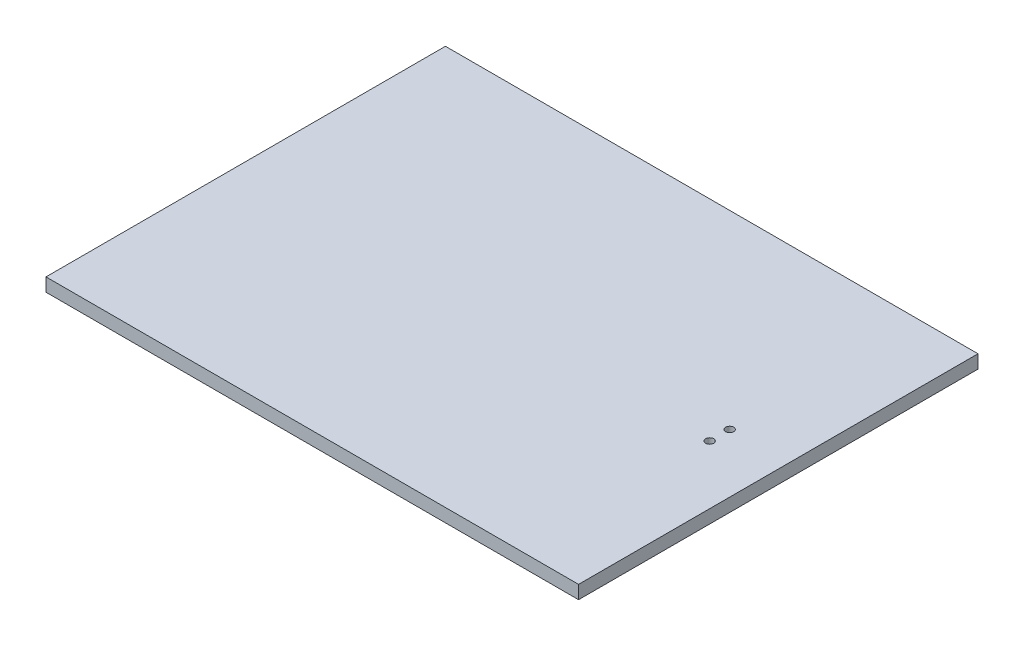
ISO-10303-21;
HEADER;
FILE_DESCRIPTION(('STEP AP214'),'2;1');
FILE_NAME('part.step','',(''),(''),'','','');
FILE_SCHEMA(('AUTOMOTIVE_DESIGN { 1 0 10303 214 1 1 1 1 }'));
ENDSEC;
DATA;
#1=APPLICATION_CONTEXT('core data for automotive mechanical design processes');
#2=APPLICATION_PROTOCOL_DEFINITION('international standard','automotive_design',2000,#1);
#3=PRODUCT_CONTEXT('',#1,'mechanical');
#4=PRODUCT('Part','Part','',(#3));
#5=PRODUCT_RELATED_PRODUCT_CATEGORY('part','',(#4));
#6=PRODUCT_DEFINITION_FORMATION('','',#4);
#7=PRODUCT_DEFINITION_CONTEXT('part definition',#1,'design');
#8=PRODUCT_DEFINITION('design','',#6,#7);
#9=PRODUCT_DEFINITION_SHAPE('','',#8);
#10=(LENGTH_UNIT() NAMED_UNIT(*) SI_UNIT(.MILLI.,.METRE.));
#11=(NAMED_UNIT(*) PLANE_ANGLE_UNIT() SI_UNIT($,.RADIAN.));
#12=(NAMED_UNIT(*) SI_UNIT($,.STERADIAN.) SOLID_ANGLE_UNIT());
#13=UNCERTAINTY_MEASURE_WITH_UNIT(LENGTH_MEASURE(1.E-05),#10,'distance_accuracy_value','');
#14=(GEOMETRIC_REPRESENTATION_CONTEXT(3) GLOBAL_UNCERTAINTY_ASSIGNED_CONTEXT((#13)) GLOBAL_UNIT_ASSIGNED_CONTEXT((#10,
#11,#12)) REPRESENTATION_CONTEXT('',''));
#15=CARTESIAN_POINT('',(0.,0.,0.));
#16=DIRECTION('',(0.,0.,1.));
#17=DIRECTION('',(1.,0.,0.));
#18=AXIS2_PLACEMENT_3D('',#15,#16,#17);
#19=CARTESIAN_POINT('',(0.,10.,0.));
#20=DIRECTION('',(0.,1.,0.));
#21=DIRECTION('',(0.,0.,1.));
#22=AXIS2_PLACEMENT_3D('',#19,#20,#21);
#23=PLANE('',#22);
#24=CARTESIAN_POINT('',(156.,10.,-7.5));
#25=DIRECTION('',(0.,1.,0.));
#26=DIRECTION('',(0.,0.,1.));
#27=AXIS2_PLACEMENT_3D('',#24,#25,#26);
#28=CIRCLE('',#27,2.99999999999999);
#29=CARTESIAN_POINT('',(156.,10.,-4.50000000000001));
#30=VERTEX_POINT('',#29);
#31=EDGE_CURVE('E99',#30,#30,#28,.T.);
#32=ORIENTED_EDGE('',*,*,#31,.F.);
#33=EDGE_LOOP('',(#32));
#34=FACE_BOUND('',#33,.T.);
#35=DIRECTION('',(0.,0.,1.));
#36=VECTOR('',#35,1.);
#37=CARTESIAN_POINT('',(-200.,10.,-150.));
#38=LINE('',#37,#36);
#39=CARTESIAN_POINT('',(-200.,10.,-150.));
#40=VERTEX_POINT('',#39);
#41=CARTESIAN_POINT('',(-200.,10.,150.));
#42=VERTEX_POINT('',#41);
#43=EDGE_CURVE('E84',#40,#42,#38,.T.);
#44=ORIENTED_EDGE('',*,*,#43,.T.);
#45=DIRECTION('',(1.,0.,0.));
#46=VECTOR('',#45,1.);
#47=CARTESIAN_POINT('',(-200.,10.,150.));
#48=LINE('',#47,#46);
#49=CARTESIAN_POINT('',(200.,10.,150.));
#50=VERTEX_POINT('',#49);
#51=EDGE_CURVE('E79',#42,#50,#48,.T.);
#52=ORIENTED_EDGE('',*,*,#51,.T.);
#53=DIRECTION('',(0.,0.,-1.));
#54=VECTOR('',#53,1.);
#55=CARTESIAN_POINT('',(200.,10.,-150.));
#56=LINE('',#55,#54);
#57=CARTESIAN_POINT('',(200.,10.,-150.));
#58=VERTEX_POINT('',#57);
#59=EDGE_CURVE('E82',#50,#58,#56,.T.);
#60=ORIENTED_EDGE('',*,*,#59,.T.);
#61=DIRECTION('',(-1.,0.,0.));
#62=VECTOR('',#61,1.);
#63=CARTESIAN_POINT('',(-200.,10.,-150.));
#64=LINE('',#63,#62);
#65=EDGE_CURVE('E49',#58,#40,#64,.T.);
#66=ORIENTED_EDGE('',*,*,#65,.T.);
#67=EDGE_LOOP('',(#44,#52,#60,#66));
#68=FACE_BOUND('',#67,.T.);
#69=CARTESIAN_POINT('',(156.,10.,7.5));
#70=DIRECTION('',(0.,1.,0.));
#71=DIRECTION('',(0.,0.,1.));
#72=AXIS2_PLACEMENT_3D('',#69,#70,#71);
#73=CIRCLE('',#72,2.99999999999999);
#74=CARTESIAN_POINT('',(156.,10.,10.5));
#75=VERTEX_POINT('',#74);
#76=EDGE_CURVE('E114',#75,#75,#73,.T.);
#77=ORIENTED_EDGE('',*,*,#76,.F.);
#78=EDGE_LOOP('',(#77));
#79=FACE_BOUND('',#78,.T.);
#80=ADVANCED_FACE('F32',(#34,#68,#79),#23,.T.);
#81=CARTESIAN_POINT('',(0.,0.,0.));
#82=DIRECTION('',(0.,1.,0.));
#83=DIRECTION('',(0.,0.,1.));
#84=AXIS2_PLACEMENT_3D('',#81,#82,#83);
#85=PLANE('',#84);
#86=DIRECTION('',(0.,0.,1.));
#87=VECTOR('',#86,1.);
#88=CARTESIAN_POINT('',(-200.,0.,-150.));
#89=LINE('',#88,#87);
#90=CARTESIAN_POINT('',(-200.,0.,-150.));
#91=VERTEX_POINT('',#90);
#92=CARTESIAN_POINT('',(-200.,0.,150.));
#93=VERTEX_POINT('',#92);
#94=EDGE_CURVE('E96',#91,#93,#89,.T.);
#95=ORIENTED_EDGE('',*,*,#94,.F.);
#96=DIRECTION('',(-1.,0.,0.));
#97=VECTOR('',#96,1.);
#98=CARTESIAN_POINT('',(-200.,0.,-150.));
#99=LINE('',#98,#97);
#100=CARTESIAN_POINT('',(200.,0.,-150.));
#101=VERTEX_POINT('',#100);
#102=EDGE_CURVE('E72',#101,#91,#99,.T.);
#103=ORIENTED_EDGE('',*,*,#102,.F.);
#104=DIRECTION('',(0.,0.,-1.));
#105=VECTOR('',#104,1.);
#106=CARTESIAN_POINT('',(200.,0.,-150.));
#107=LINE('',#106,#105);
#108=CARTESIAN_POINT('',(200.,0.,150.));
#109=VERTEX_POINT('',#108);
#110=EDGE_CURVE('E66',#109,#101,#107,.T.);
#111=ORIENTED_EDGE('',*,*,#110,.F.);
#112=DIRECTION('',(1.,0.,0.));
#113=VECTOR('',#112,1.);
#114=CARTESIAN_POINT('',(-200.,0.,150.));
#115=LINE('',#114,#113);
#116=EDGE_CURVE('E88',#93,#109,#115,.T.);
#117=ORIENTED_EDGE('',*,*,#116,.F.);
#118=EDGE_LOOP('',(#95,#103,#111,#117));
#119=FACE_BOUND('',#118,.T.);
#120=CARTESIAN_POINT('',(156.,0.,-7.5));
#121=DIRECTION('',(0.,1.,0.));
#122=DIRECTION('',(0.,0.,1.));
#123=AXIS2_PLACEMENT_3D('',#120,#121,#122);
#124=CIRCLE('',#123,2.99999999999999);
#125=CARTESIAN_POINT('',(156.,0.,-4.50000000000001));
#126=VERTEX_POINT('',#125);
#127=EDGE_CURVE('E111',#126,#126,#124,.T.);
#128=ORIENTED_EDGE('',*,*,#127,.T.);
#129=EDGE_LOOP('',(#128));
#130=FACE_BOUND('',#129,.T.);
#131=CARTESIAN_POINT('',(156.,0.,7.5));
#132=DIRECTION('',(0.,1.,0.));
#133=DIRECTION('',(0.,0.,1.));
#134=AXIS2_PLACEMENT_3D('',#131,#132,#133);
#135=CIRCLE('',#134,2.99999999999999);
#136=CARTESIAN_POINT('',(156.,0.,10.5));
#137=VERTEX_POINT('',#136);
#138=EDGE_CURVE('E117',#137,#137,#135,.T.);
#139=ORIENTED_EDGE('',*,*,#138,.T.);
#140=EDGE_LOOP('',(#139));
#141=FACE_BOUND('',#140,.T.);
#142=ADVANCED_FACE('F107',(#119,#130,#141),#85,.F.);
#143=CARTESIAN_POINT('',(-200.,10.,-150.));
#144=DIRECTION('',(1.,0.,0.));
#145=DIRECTION('',(0.,0.,-1.));
#146=AXIS2_PLACEMENT_3D('',#143,#144,#145);
#147=PLANE('',#146);
#148=ORIENTED_EDGE('',*,*,#94,.T.);
#149=DIRECTION('',(0.,-1.,0.));
#150=VECTOR('',#149,1.);
#151=CARTESIAN_POINT('',(-200.,10.,150.));
#152=LINE('',#151,#150);
#153=EDGE_CURVE('E11',#42,#93,#152,.T.);
#154=ORIENTED_EDGE('',*,*,#153,.F.);
#155=ORIENTED_EDGE('',*,*,#43,.F.);
#156=DIRECTION('',(0.,-1.,0.));
#157=VECTOR('',#156,1.);
#158=CARTESIAN_POINT('',(-200.,10.,-150.));
#159=LINE('',#158,#157);
#160=EDGE_CURVE('E92',#40,#91,#159,.T.);
#161=ORIENTED_EDGE('',*,*,#160,.T.);
#162=EDGE_LOOP('',(#148,#154,#155,#161));
#163=FACE_BOUND('',#162,.T.);
#164=ADVANCED_FACE('F34',(#163),#147,.F.);
#165=CARTESIAN_POINT('',(-200.,10.,150.));
#166=DIRECTION('',(0.,0.,-1.));
#167=DIRECTION('',(-1.,0.,0.));
#168=AXIS2_PLACEMENT_3D('',#165,#166,#167);
#169=PLANE('',#168);
#170=ORIENTED_EDGE('',*,*,#116,.T.);
#171=DIRECTION('',(0.,-1.,0.));
#172=VECTOR('',#171,1.);
#173=CARTESIAN_POINT('',(200.,10.,150.));
#174=LINE('',#173,#172);
#175=EDGE_CURVE('E41',#50,#109,#174,.T.);
#176=ORIENTED_EDGE('',*,*,#175,.F.);
#177=ORIENTED_EDGE('',*,*,#51,.F.);
#178=ORIENTED_EDGE('',*,*,#153,.T.);
#179=EDGE_LOOP('',(#170,#176,#177,#178));
#180=FACE_BOUND('',#179,.T.);
#181=ADVANCED_FACE('F87',(#180),#169,.F.);
#182=CARTESIAN_POINT('',(200.,10.,-150.));
#183=DIRECTION('',(-1.,0.,0.));
#184=DIRECTION('',(0.,0.,1.));
#185=AXIS2_PLACEMENT_3D('',#182,#183,#184);
#186=PLANE('',#185);
#187=ORIENTED_EDGE('',*,*,#110,.T.);
#188=DIRECTION('',(0.,-1.,0.));
#189=VECTOR('',#188,1.);
#190=CARTESIAN_POINT('',(200.,10.,-150.));
#191=LINE('',#190,#189);
#192=EDGE_CURVE('E89',#58,#101,#191,.T.);
#193=ORIENTED_EDGE('',*,*,#192,.F.);
#194=ORIENTED_EDGE('',*,*,#59,.F.);
#195=ORIENTED_EDGE('',*,*,#175,.T.);
#196=EDGE_LOOP('',(#187,#193,#194,#195));
#197=FACE_BOUND('',#196,.T.);
#198=ADVANCED_FACE('F90',(#197),#186,.F.);
#199=CARTESIAN_POINT('',(-200.,10.,-150.));
#200=DIRECTION('',(0.,0.,1.));
#201=DIRECTION('',(1.,0.,0.));
#202=AXIS2_PLACEMENT_3D('',#199,#200,#201);
#203=PLANE('',#202);
#204=ORIENTED_EDGE('',*,*,#102,.T.);
#205=ORIENTED_EDGE('',*,*,#160,.F.);
#206=ORIENTED_EDGE('',*,*,#65,.F.);
#207=ORIENTED_EDGE('',*,*,#192,.T.);
#208=EDGE_LOOP('',(#204,#205,#206,#207));
#209=FACE_BOUND('',#208,.T.);
#210=ADVANCED_FACE('F104',(#209),#203,.F.);
#211=CARTESIAN_POINT('',(156.,10.,-7.5));
#212=DIRECTION('',(0.,-1.,0.));
#213=DIRECTION('',(0.,0.,-1.));
#214=AXIS2_PLACEMENT_3D('',#211,#212,#213);
#215=CYLINDRICAL_SURFACE('',#214,2.99999999999999);
#216=ORIENTED_EDGE('',*,*,#31,.T.);
#217=EDGE_LOOP('',(#216));
#218=FACE_BOUND('',#217,.T.);
#219=ORIENTED_EDGE('',*,*,#127,.F.);
#220=EDGE_LOOP('',(#219));
#221=FACE_BOUND('',#220,.T.);
#222=ADVANCED_FACE('F134',(#218,#221),#215,.F.);
#223=CARTESIAN_POINT('',(156.,10.,7.5));
#224=DIRECTION('',(0.,-1.,0.));
#225=DIRECTION('',(0.,0.,-1.));
#226=AXIS2_PLACEMENT_3D('',#223,#224,#225);
#227=CYLINDRICAL_SURFACE('',#226,2.99999999999999);
#228=ORIENTED_EDGE('',*,*,#76,.T.);
#229=EDGE_LOOP('',(#228));
#230=FACE_BOUND('',#229,.T.);
#231=ORIENTED_EDGE('',*,*,#138,.F.);
#232=EDGE_LOOP('',(#231));
#233=FACE_BOUND('',#232,.T.);
#234=ADVANCED_FACE('F123',(#230,#233),#227,.F.);
#235=CLOSED_SHELL('',(#80,#142,#164,#181,#198,#210,#222,#234));
#236=MANIFOLD_SOLID_BREP('B2',#235);
#237=ADVANCED_BREP_SHAPE_REPRESENTATION('',(#18,#236),#14);
#238=SHAPE_DEFINITION_REPRESENTATION(#9,#237);
ENDSEC;
END-ISO-10303-21;
